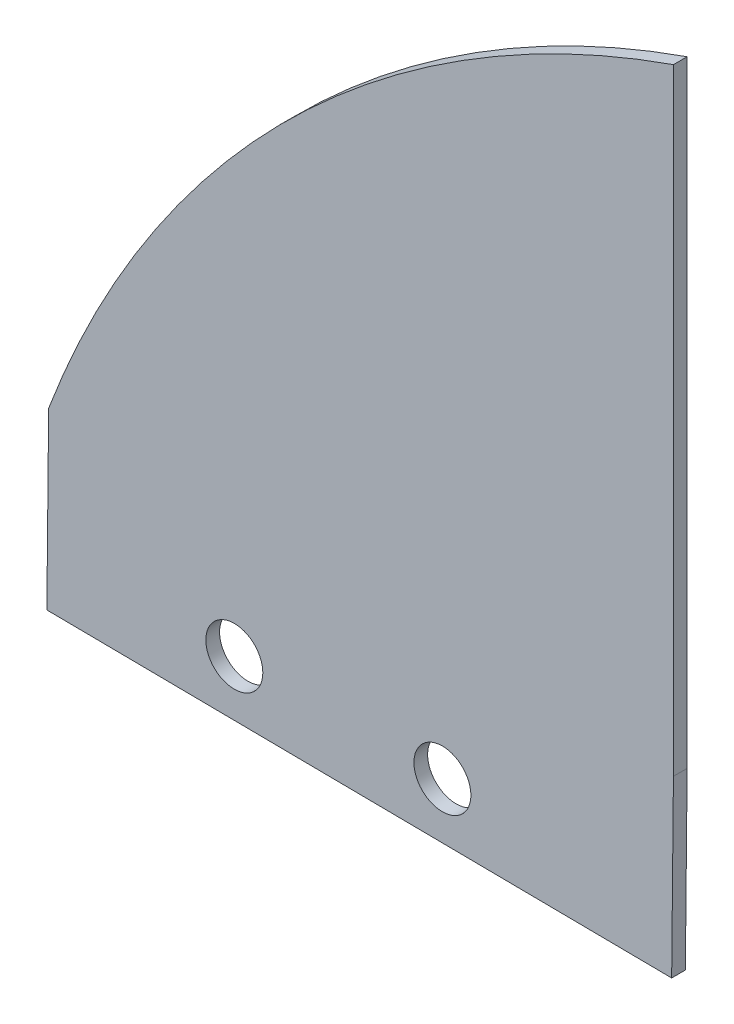
ISO-10303-21;
HEADER;
FILE_DESCRIPTION(('STEP AP214'),'2;1');
FILE_NAME('part.step','',(''),(''),'','','');
FILE_SCHEMA(('AUTOMOTIVE_DESIGN { 1 0 10303 214 1 1 1 1 }'));
ENDSEC;
DATA;
#1=APPLICATION_CONTEXT('core data for automotive mechanical design processes');
#2=APPLICATION_PROTOCOL_DEFINITION('international standard','automotive_design',2000,#1);
#3=PRODUCT_CONTEXT('',#1,'mechanical');
#4=PRODUCT('Part','Part','',(#3));
#5=PRODUCT_RELATED_PRODUCT_CATEGORY('part','',(#4));
#6=PRODUCT_DEFINITION_FORMATION('','',#4);
#7=PRODUCT_DEFINITION_CONTEXT('part definition',#1,'design');
#8=PRODUCT_DEFINITION('design','',#6,#7);
#9=PRODUCT_DEFINITION_SHAPE('','',#8);
#10=(LENGTH_UNIT() NAMED_UNIT(*) SI_UNIT(.MILLI.,.METRE.));
#11=(NAMED_UNIT(*) PLANE_ANGLE_UNIT() SI_UNIT($,.RADIAN.));
#12=(NAMED_UNIT(*) SI_UNIT($,.STERADIAN.) SOLID_ANGLE_UNIT());
#13=UNCERTAINTY_MEASURE_WITH_UNIT(LENGTH_MEASURE(1.E-05),#10,'distance_accuracy_value','');
#14=(GEOMETRIC_REPRESENTATION_CONTEXT(3) GLOBAL_UNCERTAINTY_ASSIGNED_CONTEXT((#13)) GLOBAL_UNIT_ASSIGNED_CONTEXT((#10,
#11,#12)) REPRESENTATION_CONTEXT('',''));
#15=CARTESIAN_POINT('',(0.,0.,0.));
#16=DIRECTION('',(0.,0.,1.));
#17=DIRECTION('',(1.,0.,0.));
#18=AXIS2_PLACEMENT_3D('',#15,#16,#17);
#19=CARTESIAN_POINT('',(3.49576849256722,0.,1.5875));
#20=DIRECTION('',(-1.,0.,0.));
#21=DIRECTION('',(0.,0.,1.));
#22=AXIS2_PLACEMENT_3D('',#19,#20,#21);
#23=PLANE('',#22);
#24=DIRECTION('',(0.,1.,0.));
#25=VECTOR('',#24,1.);
#26=CARTESIAN_POINT('',(3.49576849256722,0.,0.));
#27=LINE('',#26,#25);
#28=CARTESIAN_POINT('',(3.49576849256722,26.438716785904,0.));
#29=VERTEX_POINT('',#28);
#30=CARTESIAN_POINT('',(3.49576849256722,97.8329077942998,0.));
#31=VERTEX_POINT('',#30);
#32=EDGE_CURVE('E135',#29,#31,#27,.T.);
#33=ORIENTED_EDGE('',*,*,#32,.T.);
#34=DIRECTION('',(0.,0.,-1.));
#35=VECTOR('',#34,1.);
#36=CARTESIAN_POINT('',(3.49576849256722,97.8329077942998,1.5875));
#37=LINE('',#36,#35);
#38=CARTESIAN_POINT('',(3.49576849256722,97.8329077942998,1.5875));
#39=VERTEX_POINT('',#38);
#40=EDGE_CURVE('E11',#39,#31,#37,.T.);
#41=ORIENTED_EDGE('',*,*,#40,.F.);
#42=DIRECTION('',(0.,1.,0.));
#43=VECTOR('',#42,1.);
#44=CARTESIAN_POINT('',(3.49576849256722,0.,1.5875));
#45=LINE('',#44,#43);
#46=CARTESIAN_POINT('',(3.49576849256722,26.438716785904,1.5875));
#47=VERTEX_POINT('',#46);
#48=EDGE_CURVE('E159',#47,#39,#45,.T.);
#49=ORIENTED_EDGE('',*,*,#48,.F.);
#50=DIRECTION('',(0.,0.,-1.));
#51=VECTOR('',#50,1.);
#52=CARTESIAN_POINT('',(3.49576849256722,26.438716785904,1.5875));
#53=LINE('',#52,#51);
#54=EDGE_CURVE('E123',#47,#29,#53,.T.);
#55=ORIENTED_EDGE('',*,*,#54,.T.);
#56=EDGE_LOOP('',(#33,#41,#49,#55));
#57=FACE_BOUND('',#56,.T.);
#58=ADVANCED_FACE('F47',(#57),#23,.F.);
#59=CARTESIAN_POINT('',(42.8525994236117,-14.8730115669443,1.5875));
#60=DIRECTION('',(0.,0.,-1.));
#61=DIRECTION('',(-1.,0.,0.));
#62=AXIS2_PLACEMENT_3D('',#59,#60,#61);
#63=CYLINDRICAL_SURFACE('',#62,119.379999999992);
#64=CARTESIAN_POINT('',(42.8525994236117,-14.8730115669443,0.));
#65=DIRECTION('',(0.,0.,1.));
#66=DIRECTION('',(1.,0.,0.));
#67=AXIS2_PLACEMENT_3D('',#64,#65,#66);
#68=CIRCLE('',#67,119.379999999992);
#69=CARTESIAN_POINT('',(-68.878774348415,27.1708288263136,0.));
#70=VERTEX_POINT('',#69);
#71=EDGE_CURVE('E139',#31,#70,#68,.T.);
#72=ORIENTED_EDGE('',*,*,#71,.T.);
#73=DIRECTION('',(0.,0.,-1.));
#74=VECTOR('',#73,1.);
#75=CARTESIAN_POINT('',(-68.878774348415,27.1708288263136,1.5875));
#76=LINE('',#75,#74);
#77=CARTESIAN_POINT('',(-68.878774348415,27.1708288263136,1.5875));
#78=VERTEX_POINT('',#77);
#79=EDGE_CURVE('E57',#78,#70,#76,.T.);
#80=ORIENTED_EDGE('',*,*,#79,.F.);
#81=CARTESIAN_POINT('',(42.8525994236117,-14.8730115669443,1.5875));
#82=DIRECTION('',(0.,0.,1.));
#83=DIRECTION('',(1.,0.,0.));
#84=AXIS2_PLACEMENT_3D('',#81,#82,#83);
#85=CIRCLE('',#84,119.379999999992);
#86=EDGE_CURVE('E99',#39,#78,#85,.T.);
#87=ORIENTED_EDGE('',*,*,#86,.F.);
#88=ORIENTED_EDGE('',*,*,#40,.T.);
#89=EDGE_LOOP('',(#72,#80,#87,#88));
#90=FACE_BOUND('',#89,.T.);
#91=ADVANCED_FACE('F174',(#90),#63,.T.);
#92=CARTESIAN_POINT('',(-69.1465481797189,0.699458932491715,1.5875));
#93=DIRECTION('',(0.999948841228366,-0.0101150840850949,0.));
#94=DIRECTION('',(0.0101150840850949,0.999948841228366,0.));
#95=AXIS2_PLACEMENT_3D('',#92,#93,#94);
#96=PLANE('',#95);
#97=DIRECTION('',(-0.0101150840850949,-0.999948841228366,0.));
#98=VECTOR('',#97,1.);
#99=CARTESIAN_POINT('',(-69.1465481797189,0.699458932491715,0.));
#100=LINE('',#99,#98);
#101=CARTESIAN_POINT('',(-69.0845004879902,6.83331970152894,0.));
#102=VERTEX_POINT('',#101);
#103=EDGE_CURVE('E115',#70,#102,#100,.T.);
#104=ORIENTED_EDGE('',*,*,#103,.T.);
#105=DIRECTION('',(0.,0.,-1.));
#106=VECTOR('',#105,1.);
#107=CARTESIAN_POINT('',(-69.0845004879902,6.83331970152894,1.5875));
#108=LINE('',#107,#106);
#109=CARTESIAN_POINT('',(-69.0845004879902,6.83331970152894,1.5875));
#110=VERTEX_POINT('',#109);
#111=EDGE_CURVE('E112',#110,#102,#108,.T.);
#112=ORIENTED_EDGE('',*,*,#111,.F.);
#113=DIRECTION('',(-0.0101150840850949,-0.999948841228366,0.));
#114=VECTOR('',#113,1.);
#115=CARTESIAN_POINT('',(-69.1465481797189,0.699458932491715,1.5875));
#116=LINE('',#115,#114);
#117=EDGE_CURVE('E103',#78,#110,#116,.T.);
#118=ORIENTED_EDGE('',*,*,#117,.F.);
#119=ORIENTED_EDGE('',*,*,#79,.T.);
#120=EDGE_LOOP('',(#104,#112,#118,#119));
#121=FACE_BOUND('',#120,.T.);
#122=ADVANCED_FACE('F113',(#121),#96,.F.);
#123=CARTESIAN_POINT('',(0.0620476917287728,6.13386076903716,1.5875));
#124=DIRECTION('',(0.0101150840850958,0.999948841228366,0.));
#125=DIRECTION('',(-0.999948841228366,0.0101150840850958,0.));
#126=AXIS2_PLACEMENT_3D('',#123,#124,#125);
#127=PLANE('',#126);
#128=DIRECTION('',(0.999948841228366,-0.0101150840850958,0.));
#129=VECTOR('',#128,1.);
#130=CARTESIAN_POINT('',(0.0620476917287728,6.13386076903716,0.));
#131=LINE('',#130,#129);
#132=CARTESIAN_POINT('',(3.29004235299203,6.10120766111935,0.));
#133=VERTEX_POINT('',#132);
#134=EDGE_CURVE('E85',#102,#133,#131,.T.);
#135=ORIENTED_EDGE('',*,*,#134,.T.);
#136=DIRECTION('',(0.,0.,-1.));
#137=VECTOR('',#136,1.);
#138=CARTESIAN_POINT('',(3.29004235299203,6.10120766111935,1.5875));
#139=LINE('',#138,#137);
#140=CARTESIAN_POINT('',(3.29004235299203,6.10120766111935,1.5875));
#141=VERTEX_POINT('',#140);
#142=EDGE_CURVE('E117',#141,#133,#139,.T.);
#143=ORIENTED_EDGE('',*,*,#142,.F.);
#144=DIRECTION('',(0.999948841228366,-0.0101150840850958,0.));
#145=VECTOR('',#144,1.);
#146=CARTESIAN_POINT('',(0.0620476917287728,6.13386076903716,1.5875));
#147=LINE('',#146,#145);
#148=EDGE_CURVE('E107',#110,#141,#147,.T.);
#149=ORIENTED_EDGE('',*,*,#148,.F.);
#150=ORIENTED_EDGE('',*,*,#111,.T.);
#151=EDGE_LOOP('',(#135,#143,#149,#150));
#152=FACE_BOUND('',#151,.T.);
#153=ADVANCED_FACE('F119',(#152),#127,.F.);
#154=CARTESIAN_POINT('',(-47.3680631714021,13.0425385080499,1.5875));
#155=DIRECTION('',(0.,0.,-1.));
#156=DIRECTION('',(-1.,0.,0.));
#157=AXIS2_PLACEMENT_3D('',#154,#155,#156);
#158=CYLINDRICAL_SURFACE('',#157,3.3);
#159=CARTESIAN_POINT('',(-47.3680631714021,13.0425385080499,1.5875));
#160=DIRECTION('',(0.,0.,1.));
#161=DIRECTION('',(1.,0.,0.));
#162=AXIS2_PLACEMENT_3D('',#159,#160,#161);
#163=CIRCLE('',#162,3.3);
#164=CARTESIAN_POINT('',(-44.0680631714021,13.0425385080499,1.5875));
#165=VERTEX_POINT('',#164);
#166=EDGE_CURVE('E189',#165,#165,#163,.T.);
#167=ORIENTED_EDGE('',*,*,#166,.T.);
#168=EDGE_LOOP('',(#167));
#169=FACE_BOUND('',#168,.T.);
#170=CARTESIAN_POINT('',(-47.3680631714021,13.0425385080499,0.));
#171=DIRECTION('',(0.,0.,1.));
#172=DIRECTION('',(1.,0.,0.));
#173=AXIS2_PLACEMENT_3D('',#170,#171,#172);
#174=CIRCLE('',#173,3.3);
#175=CARTESIAN_POINT('',(-44.0680631714021,13.0425385080499,0.));
#176=VERTEX_POINT('',#175);
#177=EDGE_CURVE('E131',#176,#176,#174,.T.);
#178=ORIENTED_EDGE('',*,*,#177,.F.);
#179=EDGE_LOOP('',(#178));
#180=FACE_BOUND('',#179,.T.);
#181=ADVANCED_FACE('F169',(#169,#180),#158,.F.);
#182=CARTESIAN_POINT('',(-23.2662555050358,12.7987647057335,1.5875));
#183=DIRECTION('',(0.,0.,-1.));
#184=DIRECTION('',(-1.,0.,0.));
#185=AXIS2_PLACEMENT_3D('',#182,#183,#184);
#186=CYLINDRICAL_SURFACE('',#185,3.29999999999999);
#187=CARTESIAN_POINT('',(-23.2662555050358,12.7987647057335,1.5875));
#188=DIRECTION('',(0.,0.,1.));
#189=DIRECTION('',(1.,0.,0.));
#190=AXIS2_PLACEMENT_3D('',#187,#188,#189);
#191=CIRCLE('',#190,3.29999999999999);
#192=CARTESIAN_POINT('',(-19.9662555050359,12.7987647057335,1.5875));
#193=VERTEX_POINT('',#192);
#194=EDGE_CURVE('E148',#193,#193,#191,.T.);
#195=ORIENTED_EDGE('',*,*,#194,.T.);
#196=EDGE_LOOP('',(#195));
#197=FACE_BOUND('',#196,.T.);
#198=CARTESIAN_POINT('',(-23.2662555050358,12.7987647057335,0.));
#199=DIRECTION('',(0.,0.,1.));
#200=DIRECTION('',(1.,0.,0.));
#201=AXIS2_PLACEMENT_3D('',#198,#199,#200);
#202=CIRCLE('',#201,3.29999999999999);
#203=CARTESIAN_POINT('',(-19.9662555050359,12.7987647057335,0.));
#204=VERTEX_POINT('',#203);
#205=EDGE_CURVE('E127',#204,#204,#202,.T.);
#206=ORIENTED_EDGE('',*,*,#205,.F.);
#207=EDGE_LOOP('',(#206));
#208=FACE_BOUND('',#207,.T.);
#209=ADVANCED_FACE('F49',(#197,#208),#186,.F.);
#210=CARTESIAN_POINT('',(3.22799466126326,-0.0326531079178085,1.5875));
#211=DIRECTION('',(-0.999948841228366,0.0101150840850955,0.));
#212=DIRECTION('',(-0.0101150840850955,-0.999948841228366,0.));
#213=AXIS2_PLACEMENT_3D('',#210,#211,#212);
#214=PLANE('',#213);
#215=DIRECTION('',(0.0101150840850956,0.999948841228366,0.));
#216=VECTOR('',#215,1.);
#217=CARTESIAN_POINT('',(3.22799466126326,-0.0326531079178085,0.));
#218=LINE('',#217,#216);
#219=EDGE_CURVE('E91',#133,#29,#218,.T.);
#220=ORIENTED_EDGE('',*,*,#219,.T.);
#221=ORIENTED_EDGE('',*,*,#54,.F.);
#222=DIRECTION('',(0.0101150840850956,0.999948841228366,0.));
#223=VECTOR('',#222,1.);
#224=CARTESIAN_POINT('',(3.22799466126326,-0.0326531079178085,1.5875));
#225=LINE('',#224,#223);
#226=EDGE_CURVE('E65',#141,#47,#225,.T.);
#227=ORIENTED_EDGE('',*,*,#226,.F.);
#228=ORIENTED_EDGE('',*,*,#142,.T.);
#229=EDGE_LOOP('',(#220,#221,#227,#228));
#230=FACE_BOUND('',#229,.T.);
#231=ADVANCED_FACE('F160',(#230),#214,.F.);
#232=CARTESIAN_POINT('',(0.,0.,1.5875));
#233=DIRECTION('',(0.,0.,1.));
#234=DIRECTION('',(1.,0.,0.));
#235=AXIS2_PLACEMENT_3D('',#232,#233,#234);
#236=PLANE('',#235);
#237=ORIENTED_EDGE('',*,*,#194,.F.);
#238=EDGE_LOOP('',(#237));
#239=FACE_BOUND('',#238,.T.);
#240=ORIENTED_EDGE('',*,*,#166,.F.);
#241=EDGE_LOOP('',(#240));
#242=FACE_BOUND('',#241,.T.);
#243=ORIENTED_EDGE('',*,*,#48,.T.);
#244=ORIENTED_EDGE('',*,*,#86,.T.);
#245=ORIENTED_EDGE('',*,*,#117,.T.);
#246=ORIENTED_EDGE('',*,*,#148,.T.);
#247=ORIENTED_EDGE('',*,*,#226,.T.);
#248=EDGE_LOOP('',(#243,#244,#245,#246,#247));
#249=FACE_BOUND('',#248,.T.);
#250=ADVANCED_FACE('F105',(#239,#242,#249),#236,.T.);
#251=CARTESIAN_POINT('',(0.,0.,0.));
#252=DIRECTION('',(0.,0.,1.));
#253=DIRECTION('',(1.,0.,0.));
#254=AXIS2_PLACEMENT_3D('',#251,#252,#253);
#255=PLANE('',#254);
#256=ORIENTED_EDGE('',*,*,#205,.T.);
#257=EDGE_LOOP('',(#256));
#258=FACE_BOUND('',#257,.T.);
#259=ORIENTED_EDGE('',*,*,#177,.T.);
#260=EDGE_LOOP('',(#259));
#261=FACE_BOUND('',#260,.T.);
#262=ORIENTED_EDGE('',*,*,#32,.F.);
#263=ORIENTED_EDGE('',*,*,#219,.F.);
#264=ORIENTED_EDGE('',*,*,#134,.F.);
#265=ORIENTED_EDGE('',*,*,#103,.F.);
#266=ORIENTED_EDGE('',*,*,#71,.F.);
#267=EDGE_LOOP('',(#262,#263,#264,#265,#266));
#268=FACE_BOUND('',#267,.T.);
#269=ADVANCED_FACE('F155',(#258,#261,#268),#255,.F.);
#270=CLOSED_SHELL('',(#58,#91,#122,#153,#181,#209,#231,#250,#269));
#271=MANIFOLD_SOLID_BREP('B2',#270);
#272=ADVANCED_BREP_SHAPE_REPRESENTATION('',(#18,#271),#14);
#273=SHAPE_DEFINITION_REPRESENTATION(#9,#272);
ENDSEC;
END-ISO-10303-21;
